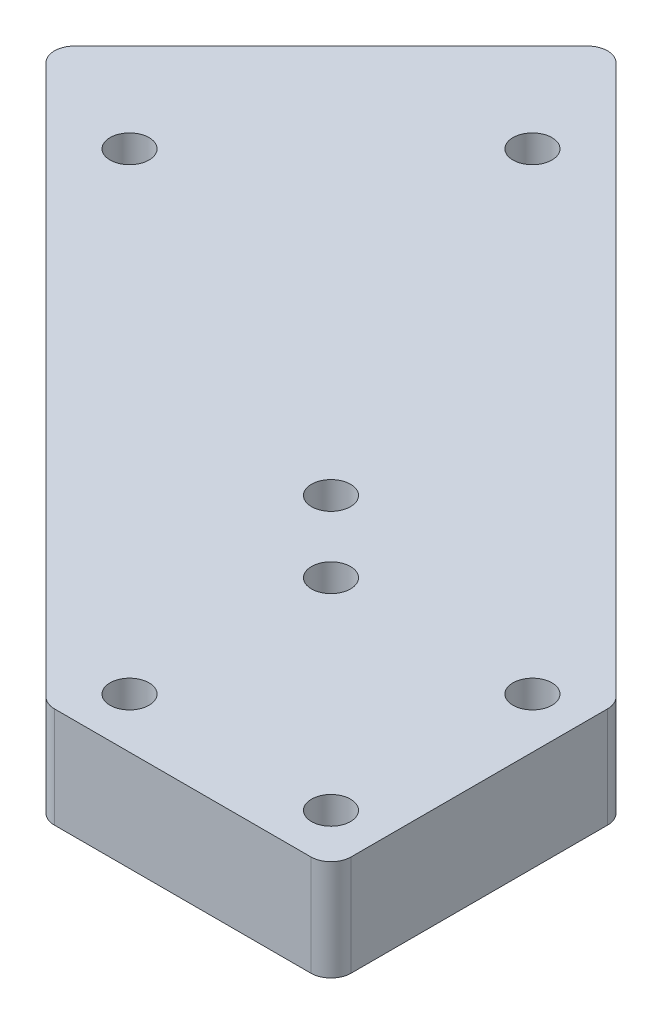
ISO-10303-21;
HEADER;
FILE_DESCRIPTION(('STEP AP214'),'2;1');
FILE_NAME('part.step','',(''),(''),'','','');
FILE_SCHEMA(('AUTOMOTIVE_DESIGN { 1 0 10303 214 1 1 1 1 }'));
ENDSEC;
DATA;
#1=APPLICATION_CONTEXT('core data for automotive mechanical design processes');
#2=APPLICATION_PROTOCOL_DEFINITION('international standard','automotive_design',2000,#1);
#3=PRODUCT_CONTEXT('',#1,'mechanical');
#4=PRODUCT('Part','Part','',(#3));
#5=PRODUCT_RELATED_PRODUCT_CATEGORY('part','',(#4));
#6=PRODUCT_DEFINITION_FORMATION('','',#4);
#7=PRODUCT_DEFINITION_CONTEXT('part definition',#1,'design');
#8=PRODUCT_DEFINITION('design','',#6,#7);
#9=PRODUCT_DEFINITION_SHAPE('','',#8);
#10=(LENGTH_UNIT() NAMED_UNIT(*) SI_UNIT(.MILLI.,.METRE.));
#11=(NAMED_UNIT(*) PLANE_ANGLE_UNIT() SI_UNIT($,.RADIAN.));
#12=(NAMED_UNIT(*) SI_UNIT($,.STERADIAN.) SOLID_ANGLE_UNIT());
#13=UNCERTAINTY_MEASURE_WITH_UNIT(LENGTH_MEASURE(1.E-05),#10,'distance_accuracy_value','');
#14=(GEOMETRIC_REPRESENTATION_CONTEXT(3) GLOBAL_UNCERTAINTY_ASSIGNED_CONTEXT((#13)) GLOBAL_UNIT_ASSIGNED_CONTEXT((#10,
#11,#12)) REPRESENTATION_CONTEXT('',''));
#15=CARTESIAN_POINT('',(0.,0.,0.));
#16=DIRECTION('',(0.,0.,1.));
#17=DIRECTION('',(1.,0.,0.));
#18=AXIS2_PLACEMENT_3D('',#15,#16,#17);
#19=CARTESIAN_POINT('',(0.,12.7,35.9210244842766));
#20=DIRECTION('',(0.,0.,-1.));
#21=DIRECTION('',(-1.,0.,0.));
#22=AXIS2_PLACEMENT_3D('',#19,#20,#21);
#23=PLANE('',#22);
#24=DIRECTION('',(1.,0.,0.));
#25=VECTOR('',#24,1.);
#26=CARTESIAN_POINT('',(0.,0.,35.9210244842766));
#27=LINE('',#26,#25);
#28=CARTESIAN_POINT('',(1.05210244842767,0.,35.9210244842766));
#29=VERTEX_POINT('',#28);
#30=CARTESIAN_POINT('',(33.3810244842766,0.,35.9210244842766));
#31=VERTEX_POINT('',#30);
#32=EDGE_CURVE('E212',#29,#31,#27,.T.);
#33=ORIENTED_EDGE('',*,*,#32,.T.);
#34=DIRECTION('',(0.,-1.,0.));
#35=VECTOR('',#34,1.);
#36=CARTESIAN_POINT('',(33.3810244842766,12.7,35.9210244842766));
#37=LINE('',#36,#35);
#38=CARTESIAN_POINT('',(33.3810244842766,12.7,35.9210244842766));
#39=VERTEX_POINT('',#38);
#40=EDGE_CURVE('E11',#31,#39,#37,.F.);
#41=ORIENTED_EDGE('',*,*,#40,.T.);
#42=DIRECTION('',(1.,0.,0.));
#43=VECTOR('',#42,1.);
#44=CARTESIAN_POINT('',(0.,12.7,35.9210244842766));
#45=LINE('',#44,#43);
#46=CARTESIAN_POINT('',(1.05210244842767,12.7,35.9210244842766));
#47=VERTEX_POINT('',#46);
#48=EDGE_CURVE('E159',#47,#39,#45,.T.);
#49=ORIENTED_EDGE('',*,*,#48,.F.);
#50=DIRECTION('',(0.,-1.,0.));
#51=VECTOR('',#50,1.);
#52=CARTESIAN_POINT('',(1.05210244842767,0.,35.9210244842766));
#53=LINE('',#52,#51);
#54=EDGE_CURVE('E54',#47,#29,#53,.T.);
#55=ORIENTED_EDGE('',*,*,#54,.T.);
#56=EDGE_LOOP('',(#33,#41,#49,#55));
#57=FACE_BOUND('',#56,.T.);
#58=ADVANCED_FACE('F45',(#57),#23,.F.);
#59=CARTESIAN_POINT('',(35.9210244842766,12.7,0.));
#60=DIRECTION('',(-1.,0.,0.));
#61=DIRECTION('',(0.,0.,1.));
#62=AXIS2_PLACEMENT_3D('',#59,#60,#61);
#63=PLANE('',#62);
#64=DIRECTION('',(0.,0.,-1.));
#65=VECTOR('',#64,1.);
#66=CARTESIAN_POINT('',(35.9210244842766,0.,0.));
#67=LINE('',#66,#65);
#68=CARTESIAN_POINT('',(35.9210244842766,0.,33.3810244842766));
#69=VERTEX_POINT('',#68);
#70=CARTESIAN_POINT('',(35.9210244842766,0.,1.05210244842766));
#71=VERTEX_POINT('',#70);
#72=EDGE_CURVE('E162',#69,#71,#67,.T.);
#73=ORIENTED_EDGE('',*,*,#72,.T.);
#74=DIRECTION('',(0.,-1.,0.));
#75=VECTOR('',#74,1.);
#76=CARTESIAN_POINT('',(35.9210244842766,12.7,1.05210244842766));
#77=LINE('',#76,#75);
#78=CARTESIAN_POINT('',(35.9210244842766,12.7,1.05210244842766));
#79=VERTEX_POINT('',#78);
#80=EDGE_CURVE('E61',#71,#79,#77,.F.);
#81=ORIENTED_EDGE('',*,*,#80,.T.);
#82=DIRECTION('',(0.,0.,-1.));
#83=VECTOR('',#82,1.);
#84=CARTESIAN_POINT('',(35.9210244842766,12.7,0.));
#85=LINE('',#84,#83);
#86=CARTESIAN_POINT('',(35.9210244842766,12.7,33.3810244842766));
#87=VERTEX_POINT('',#86);
#88=EDGE_CURVE('E153',#87,#79,#85,.T.);
#89=ORIENTED_EDGE('',*,*,#88,.F.);
#90=DIRECTION('',(0.,-1.,0.));
#91=VECTOR('',#90,1.);
#92=CARTESIAN_POINT('',(35.9210244842766,12.7,33.3810244842766));
#93=LINE('',#92,#91);
#94=EDGE_CURVE('E200',#87,#69,#93,.T.);
#95=ORIENTED_EDGE('',*,*,#94,.T.);
#96=EDGE_LOOP('',(#73,#81,#89,#95));
#97=FACE_BOUND('',#96,.T.);
#98=ADVANCED_FACE('F300',(#97),#63,.F.);
#99=CARTESIAN_POINT('',(0.,12.7,0.));
#100=DIRECTION('',(0.,1.,0.));
#101=DIRECTION('',(0.,0.,1.));
#102=AXIS2_PLACEMENT_3D('',#99,#100,#101);
#103=PLANE('',#102);
#104=CARTESIAN_POINT('',(-55.3542987302698,12.7,-29.9581344198867));
#105=DIRECTION('',(0.,1.,0.));
#106=DIRECTION('',(0.,0.,1.));
#107=AXIS2_PLACEMENT_3D('',#104,#105,#106);
#108=CIRCLE('',#107,2.45744999999999);
#109=CARTESIAN_POINT('',(-55.3542987302698,12.7,-27.5006844198867));
#110=VERTEX_POINT('',#109);
#111=EDGE_CURVE('E290',#110,#110,#108,.T.);
#112=ORIENTED_EDGE('',*,*,#111,.F.);
#113=EDGE_LOOP('',(#112));
#114=FACE_BOUND('',#113,.T.);
#115=CARTESIAN_POINT('',(-29.9581344198862,12.7,-55.3542987302702));
#116=DIRECTION('',(0.,1.,0.));
#117=DIRECTION('',(0.,0.,1.));
#118=AXIS2_PLACEMENT_3D('',#115,#116,#117);
#119=CIRCLE('',#118,2.45744999999999);
#120=CARTESIAN_POINT('',(-29.9581344198862,12.7,-52.8968487302703));
#121=VERTEX_POINT('',#120);
#122=EDGE_CURVE('E282',#121,#121,#119,.T.);
#123=ORIENTED_EDGE('',*,*,#122,.F.);
#124=EDGE_LOOP('',(#123));
#125=FACE_BOUND('',#124,.T.);
#126=CARTESIAN_POINT('',(29.5710244842766,12.7,29.5710244842766));
#127=DIRECTION('',(0.,-1.,0.));
#128=DIRECTION('',(0.,0.,-1.));
#129=AXIS2_PLACEMENT_3D('',#126,#127,#128);
#130=CIRCLE('',#129,2.45745);
#131=CARTESIAN_POINT('',(29.5710244842766,12.7,27.1135744842766));
#132=VERTEX_POINT('',#131);
#133=EDGE_CURVE('E270',#132,#132,#130,.T.);
#134=ORIENTED_EDGE('',*,*,#133,.T.);
#135=EDGE_LOOP('',(#134));
#136=FACE_BOUND('',#135,.T.);
#137=CARTESIAN_POINT('',(4.17102448427662,12.7,4.17102448427661));
#138=DIRECTION('',(0.,-1.,0.));
#139=DIRECTION('',(0.,0.,-1.));
#140=AXIS2_PLACEMENT_3D('',#137,#138,#139);
#141=CIRCLE('',#140,2.45745);
#142=CARTESIAN_POINT('',(4.17102448427662,12.7,1.71357448427662));
#143=VERTEX_POINT('',#142);
#144=EDGE_CURVE('E262',#143,#143,#141,.T.);
#145=ORIENTED_EDGE('',*,*,#144,.T.);
#146=EDGE_LOOP('',(#145));
#147=FACE_BOUND('',#146,.T.);
#148=CARTESIAN_POINT('',(29.5710244842766,12.7,4.17102448427661));
#149=DIRECTION('',(0.,-1.,0.));
#150=DIRECTION('',(0.,0.,-1.));
#151=AXIS2_PLACEMENT_3D('',#148,#149,#150);
#152=CIRCLE('',#151,2.45745);
#153=CARTESIAN_POINT('',(29.5710244842766,12.7,1.71357448427661));
#154=VERTEX_POINT('',#153);
#155=EDGE_CURVE('E254',#154,#154,#152,.T.);
#156=ORIENTED_EDGE('',*,*,#155,.T.);
#157=EDGE_LOOP('',(#156));
#158=FACE_BOUND('',#157,.T.);
#159=CARTESIAN_POINT('',(4.17102448427662,12.7,29.5710244842766));
#160=DIRECTION('',(0.,-1.,0.));
#161=DIRECTION('',(0.,0.,-1.));
#162=AXIS2_PLACEMENT_3D('',#159,#160,#161);
#163=CIRCLE('',#162,2.45745);
#164=CARTESIAN_POINT('',(4.17102448427662,12.7,27.1135744842766));
#165=VERTEX_POINT('',#164);
#166=EDGE_CURVE('E246',#165,#165,#163,.T.);
#167=ORIENTED_EDGE('',*,*,#166,.T.);
#168=EDGE_LOOP('',(#167));
#169=FACE_BOUND('',#168,.T.);
#170=CARTESIAN_POINT('',(-4.80923163679253,12.7,-4.80923163679254));
#171=DIRECTION('',(0.,-1.,0.));
#172=DIRECTION('',(0.,0.,-1.));
#173=AXIS2_PLACEMENT_3D('',#170,#171,#172);
#174=CIRCLE('',#173,2.45745);
#175=CARTESIAN_POINT('',(-4.80923163679253,12.7,-7.26668163679254));
#176=VERTEX_POINT('',#175);
#177=EDGE_CURVE('E233',#176,#176,#174,.T.);
#178=ORIENTED_EDGE('',*,*,#177,.T.);
#179=EDGE_LOOP('',(#178));
#180=FACE_BOUND('',#179,.T.);
#181=DIRECTION('',(-0.707106781186548,0.,-0.707106781186547));
#182=VECTOR('',#181,1.);
#183=CARTESIAN_POINT('',(-17.9605122421383,12.7,-53.8815367264149));
#184=LINE('',#183,#182);
#185=CARTESIAN_POINT('',(35.1770757084905,12.7,-0.743948775786173));
#186=VERTEX_POINT('',#185);
#187=CARTESIAN_POINT('',(-34.1249732600628,12.7,-70.0459977443394));
#188=VERTEX_POINT('',#187);
#189=EDGE_CURVE('E229',#186,#188,#184,.T.);
#190=ORIENTED_EDGE('',*,*,#189,.T.);
#191=CARTESIAN_POINT('',(-35.9210244842766,12.7,-68.2499465201256));
#192=DIRECTION('',(0.,1.,0.));
#193=DIRECTION('',(0.,0.,1.));
#194=AXIS2_PLACEMENT_3D('',#191,#192,#193);
#195=CIRCLE('',#194,2.54);
#196=CARTESIAN_POINT('',(-37.7170757084904,12.7,-70.0459977443394));
#197=VERTEX_POINT('',#196);
#198=EDGE_CURVE('E191',#188,#197,#195,.T.);
#199=ORIENTED_EDGE('',*,*,#198,.T.);
#200=DIRECTION('',(0.707106781186547,0.,-0.707106781186548));
#201=VECTOR('',#200,1.);
#202=CARTESIAN_POINT('',(-71.8420489685532,12.7,-35.9210244842766));
#203=LINE('',#202,#201);
#204=CARTESIAN_POINT('',(-70.0459977443394,12.7,-37.7170757084904));
#205=VERTEX_POINT('',#204);
#206=EDGE_CURVE('E147',#205,#197,#203,.T.);
#207=ORIENTED_EDGE('',*,*,#206,.F.);
#208=CARTESIAN_POINT('',(-68.2499465201256,12.7,-35.9210244842766));
#209=DIRECTION('',(0.,1.,0.));
#210=DIRECTION('',(0.,0.,1.));
#211=AXIS2_PLACEMENT_3D('',#208,#209,#210);
#212=CIRCLE('',#211,2.54);
#213=CARTESIAN_POINT('',(-70.0459977443394,12.7,-34.1249732600628));
#214=VERTEX_POINT('',#213);
#215=EDGE_CURVE('E151',#205,#214,#212,.T.);
#216=ORIENTED_EDGE('',*,*,#215,.T.);
#217=DIRECTION('',(-0.707106781186548,0.,-0.707106781186548));
#218=VECTOR('',#217,1.);
#219=CARTESIAN_POINT('',(0.,12.7,35.9210244842766));
#220=LINE('',#219,#218);
#221=CARTESIAN_POINT('',(-0.74394877578616,12.7,35.1770757084904));
#222=VERTEX_POINT('',#221);
#223=EDGE_CURVE('E228',#222,#214,#220,.T.);
#224=ORIENTED_EDGE('',*,*,#223,.F.);
#225=CARTESIAN_POINT('',(1.05210244842767,12.7,33.3810244842766));
#226=DIRECTION('',(0.,1.,0.));
#227=DIRECTION('',(0.,0.,1.));
#228=AXIS2_PLACEMENT_3D('',#225,#226,#227);
#229=CIRCLE('',#228,2.54);
#230=EDGE_CURVE('E181',#222,#47,#229,.T.);
#231=ORIENTED_EDGE('',*,*,#230,.T.);
#232=ORIENTED_EDGE('',*,*,#48,.T.);
#233=CARTESIAN_POINT('',(33.3810244842766,12.7,33.3810244842766));
#234=DIRECTION('',(0.,1.,0.));
#235=DIRECTION('',(0.,0.,1.));
#236=AXIS2_PLACEMENT_3D('',#233,#234,#235);
#237=CIRCLE('',#236,2.54);
#238=EDGE_CURVE('E68',#39,#87,#237,.T.);
#239=ORIENTED_EDGE('',*,*,#238,.T.);
#240=ORIENTED_EDGE('',*,*,#88,.T.);
#241=CARTESIAN_POINT('',(33.3810244842766,12.7,1.05210244842766));
#242=DIRECTION('',(0.,1.,0.));
#243=DIRECTION('',(0.,0.,1.));
#244=AXIS2_PLACEMENT_3D('',#241,#242,#243);
#245=CIRCLE('',#244,2.54);
#246=EDGE_CURVE('E186',#79,#186,#245,.T.);
#247=ORIENTED_EDGE('',*,*,#246,.T.);
#248=EDGE_LOOP('',(#190,#199,#207,#216,#224,#231,#232,#239,#240,#247));
#249=FACE_BOUND('',#248,.T.);
#250=ADVANCED_FACE('F297',(#114,#125,#136,#147,#158,#169,#180,#249),#103,.T.);
#251=CARTESIAN_POINT('',(0.,0.,0.));
#252=DIRECTION('',(0.,1.,0.));
#253=DIRECTION('',(0.,0.,1.));
#254=AXIS2_PLACEMENT_3D('',#251,#252,#253);
#255=PLANE('',#254);
#256=CARTESIAN_POINT('',(-55.3542987302698,0.,-29.9581344198867));
#257=DIRECTION('',(0.,1.,0.));
#258=DIRECTION('',(0.,0.,1.));
#259=AXIS2_PLACEMENT_3D('',#256,#257,#258);
#260=CIRCLE('',#259,2.45745);
#261=CARTESIAN_POINT('',(-55.3542987302698,0.,-27.5006844198867));
#262=VERTEX_POINT('',#261);
#263=EDGE_CURVE('E286',#262,#262,#260,.T.);
#264=ORIENTED_EDGE('',*,*,#263,.T.);
#265=EDGE_LOOP('',(#264));
#266=FACE_BOUND('',#265,.T.);
#267=CARTESIAN_POINT('',(-29.9581344198862,0.,-55.3542987302702));
#268=DIRECTION('',(0.,1.,0.));
#269=DIRECTION('',(0.,0.,1.));
#270=AXIS2_PLACEMENT_3D('',#267,#268,#269);
#271=CIRCLE('',#270,2.45745);
#272=CARTESIAN_POINT('',(-29.9581344198862,0.,-52.8968487302702));
#273=VERTEX_POINT('',#272);
#274=EDGE_CURVE('E278',#273,#273,#271,.T.);
#275=ORIENTED_EDGE('',*,*,#274,.T.);
#276=EDGE_LOOP('',(#275));
#277=FACE_BOUND('',#276,.T.);
#278=CARTESIAN_POINT('',(29.5710244842766,0.,29.5710244842766));
#279=DIRECTION('',(0.,-1.,0.));
#280=DIRECTION('',(0.,0.,-1.));
#281=AXIS2_PLACEMENT_3D('',#278,#279,#280);
#282=CIRCLE('',#281,2.45745);
#283=CARTESIAN_POINT('',(29.5710244842766,0.,27.1135744842766));
#284=VERTEX_POINT('',#283);
#285=EDGE_CURVE('E274',#284,#284,#282,.T.);
#286=ORIENTED_EDGE('',*,*,#285,.F.);
#287=EDGE_LOOP('',(#286));
#288=FACE_BOUND('',#287,.T.);
#289=CARTESIAN_POINT('',(4.17102448427662,0.,4.17102448427661));
#290=DIRECTION('',(0.,-1.,0.));
#291=DIRECTION('',(0.,0.,-1.));
#292=AXIS2_PLACEMENT_3D('',#289,#290,#291);
#293=CIRCLE('',#292,2.45745);
#294=CARTESIAN_POINT('',(4.17102448427662,0.,1.71357448427662));
#295=VERTEX_POINT('',#294);
#296=EDGE_CURVE('E266',#295,#295,#293,.T.);
#297=ORIENTED_EDGE('',*,*,#296,.F.);
#298=EDGE_LOOP('',(#297));
#299=FACE_BOUND('',#298,.T.);
#300=CARTESIAN_POINT('',(29.5710244842766,0.,4.17102448427661));
#301=DIRECTION('',(0.,-1.,0.));
#302=DIRECTION('',(0.,0.,-1.));
#303=AXIS2_PLACEMENT_3D('',#300,#301,#302);
#304=CIRCLE('',#303,2.45745);
#305=CARTESIAN_POINT('',(29.5710244842766,0.,1.71357448427661));
#306=VERTEX_POINT('',#305);
#307=EDGE_CURVE('E258',#306,#306,#304,.T.);
#308=ORIENTED_EDGE('',*,*,#307,.F.);
#309=EDGE_LOOP('',(#308));
#310=FACE_BOUND('',#309,.T.);
#311=CARTESIAN_POINT('',(4.17102448427662,0.,29.5710244842766));
#312=DIRECTION('',(0.,-1.,0.));
#313=DIRECTION('',(0.,0.,-1.));
#314=AXIS2_PLACEMENT_3D('',#311,#312,#313);
#315=CIRCLE('',#314,2.45745);
#316=CARTESIAN_POINT('',(4.17102448427662,0.,27.1135744842766));
#317=VERTEX_POINT('',#316);
#318=EDGE_CURVE('E250',#317,#317,#315,.T.);
#319=ORIENTED_EDGE('',*,*,#318,.F.);
#320=EDGE_LOOP('',(#319));
#321=FACE_BOUND('',#320,.T.);
#322=CARTESIAN_POINT('',(-4.80923163679253,0.,-4.80923163679254));
#323=DIRECTION('',(0.,-1.,0.));
#324=DIRECTION('',(0.,0.,-1.));
#325=AXIS2_PLACEMENT_3D('',#322,#323,#324);
#326=CIRCLE('',#325,2.45745);
#327=CARTESIAN_POINT('',(-4.80923163679253,0.,-7.26668163679254));
#328=VERTEX_POINT('',#327);
#329=EDGE_CURVE('E242',#328,#328,#326,.T.);
#330=ORIENTED_EDGE('',*,*,#329,.F.);
#331=EDGE_LOOP('',(#330));
#332=FACE_BOUND('',#331,.T.);
#333=DIRECTION('',(0.707106781186547,0.,-0.707106781186548));
#334=VECTOR('',#333,1.);
#335=CARTESIAN_POINT('',(-71.8420489685532,0.,-35.9210244842766));
#336=LINE('',#335,#334);
#337=CARTESIAN_POINT('',(-70.0459977443394,0.,-37.7170757084904));
#338=VERTEX_POINT('',#337);
#339=CARTESIAN_POINT('',(-37.7170757084904,0.,-70.0459977443394));
#340=VERTEX_POINT('',#339);
#341=EDGE_CURVE('E127',#338,#340,#336,.T.);
#342=ORIENTED_EDGE('',*,*,#341,.T.);
#343=CARTESIAN_POINT('',(-35.9210244842766,0.,-68.2499465201256));
#344=DIRECTION('',(0.,1.,0.));
#345=DIRECTION('',(0.,0.,1.));
#346=AXIS2_PLACEMENT_3D('',#343,#344,#345);
#347=CIRCLE('',#346,2.54);
#348=CARTESIAN_POINT('',(-34.1249732600628,0.,-70.0459977443394));
#349=VERTEX_POINT('',#348);
#350=EDGE_CURVE('E135',#340,#349,#347,.F.);
#351=ORIENTED_EDGE('',*,*,#350,.T.);
#352=DIRECTION('',(0.707106781186548,0.,0.707106781186547));
#353=VECTOR('',#352,1.);
#354=CARTESIAN_POINT('',(17.9605122421383,0.,-17.9605122421383));
#355=LINE('',#354,#353);
#356=CARTESIAN_POINT('',(35.1770757084904,0.,-0.743948775786173));
#357=VERTEX_POINT('',#356);
#358=EDGE_CURVE('E224',#349,#357,#355,.T.);
#359=ORIENTED_EDGE('',*,*,#358,.T.);
#360=CARTESIAN_POINT('',(33.3810244842766,0.,1.05210244842766));
#361=DIRECTION('',(0.,1.,0.));
#362=DIRECTION('',(0.,0.,1.));
#363=AXIS2_PLACEMENT_3D('',#360,#361,#362);
#364=CIRCLE('',#363,2.54);
#365=EDGE_CURVE('E136',#357,#71,#364,.F.);
#366=ORIENTED_EDGE('',*,*,#365,.T.);
#367=ORIENTED_EDGE('',*,*,#72,.F.);
#368=CARTESIAN_POINT('',(33.3810244842766,0.,33.3810244842766));
#369=DIRECTION('',(0.,1.,0.));
#370=DIRECTION('',(0.,0.,1.));
#371=AXIS2_PLACEMENT_3D('',#368,#369,#370);
#372=CIRCLE('',#371,2.54);
#373=EDGE_CURVE('E167',#69,#31,#372,.F.);
#374=ORIENTED_EDGE('',*,*,#373,.T.);
#375=ORIENTED_EDGE('',*,*,#32,.F.);
#376=CARTESIAN_POINT('',(1.05210244842767,0.,33.3810244842766));
#377=DIRECTION('',(0.,1.,0.));
#378=DIRECTION('',(0.,0.,1.));
#379=AXIS2_PLACEMENT_3D('',#376,#377,#378);
#380=CIRCLE('',#379,2.54);
#381=CARTESIAN_POINT('',(-0.743948775786162,0.,35.1770757084904));
#382=VERTEX_POINT('',#381);
#383=EDGE_CURVE('E157',#29,#382,#380,.F.);
#384=ORIENTED_EDGE('',*,*,#383,.T.);
#385=DIRECTION('',(0.707106781186548,0.,0.707106781186547));
#386=VECTOR('',#385,1.);
#387=CARTESIAN_POINT('',(-17.9605122421383,0.,17.9605122421383));
#388=LINE('',#387,#386);
#389=CARTESIAN_POINT('',(-70.0459977443394,0.,-34.1249732600628));
#390=VERTEX_POINT('',#389);
#391=EDGE_CURVE('E129',#390,#382,#388,.T.);
#392=ORIENTED_EDGE('',*,*,#391,.F.);
#393=CARTESIAN_POINT('',(-68.2499465201256,0.,-35.9210244842766));
#394=DIRECTION('',(0.,1.,0.));
#395=DIRECTION('',(0.,0.,1.));
#396=AXIS2_PLACEMENT_3D('',#393,#394,#395);
#397=CIRCLE('',#396,2.54);
#398=EDGE_CURVE('E124',#390,#338,#397,.F.);
#399=ORIENTED_EDGE('',*,*,#398,.T.);
#400=EDGE_LOOP('',(#342,#351,#359,#366,#367,#374,#375,#384,#392,#399));
#401=FACE_BOUND('',#400,.T.);
#402=ADVANCED_FACE('F126',(#266,#277,#288,#299,#310,#321,#332,#401),#255,.F.);
#403=CARTESIAN_POINT('',(-71.8420489685532,12.7,-35.9210244842766));
#404=DIRECTION('',(0.707106781186548,0.,0.707106781186547));
#405=DIRECTION('',(0.707106781186547,0.,-0.707106781186548));
#406=AXIS2_PLACEMENT_3D('',#403,#404,#405);
#407=PLANE('',#406);
#408=ORIENTED_EDGE('',*,*,#206,.T.);
#409=DIRECTION('',(0.,-1.,0.));
#410=VECTOR('',#409,1.);
#411=CARTESIAN_POINT('',(-37.7170757084904,12.7,-70.0459977443394));
#412=LINE('',#411,#410);
#413=EDGE_CURVE('E145',#197,#340,#412,.T.);
#414=ORIENTED_EDGE('',*,*,#413,.T.);
#415=ORIENTED_EDGE('',*,*,#341,.F.);
#416=DIRECTION('',(0.,-1.,0.));
#417=VECTOR('',#416,1.);
#418=CARTESIAN_POINT('',(-70.0459977443394,12.7,-37.7170757084904));
#419=LINE('',#418,#417);
#420=EDGE_CURVE('E142',#338,#205,#419,.F.);
#421=ORIENTED_EDGE('',*,*,#420,.T.);
#422=EDGE_LOOP('',(#408,#414,#415,#421));
#423=FACE_BOUND('',#422,.T.);
#424=ADVANCED_FACE('F141',(#423),#407,.F.);
#425=CARTESIAN_POINT('',(-17.9605122421383,0.,17.9605122421383));
#426=DIRECTION('',(-0.707106781186547,0.,0.707106781186548));
#427=DIRECTION('',(0.707106781186548,0.,0.707106781186547));
#428=AXIS2_PLACEMENT_3D('',#425,#426,#427);
#429=PLANE('',#428);
#430=ORIENTED_EDGE('',*,*,#223,.T.);
#431=DIRECTION('',(0.,-1.,0.));
#432=VECTOR('',#431,1.);
#433=CARTESIAN_POINT('',(-70.0459977443394,0.,-34.1249732600628));
#434=LINE('',#433,#432);
#435=EDGE_CURVE('E197',#214,#390,#434,.T.);
#436=ORIENTED_EDGE('',*,*,#435,.T.);
#437=ORIENTED_EDGE('',*,*,#391,.T.);
#438=DIRECTION('',(0.,-1.,0.));
#439=VECTOR('',#438,1.);
#440=CARTESIAN_POINT('',(-0.743948775786164,12.7,35.1770757084904));
#441=LINE('',#440,#439);
#442=EDGE_CURVE('E194',#382,#222,#441,.F.);
#443=ORIENTED_EDGE('',*,*,#442,.T.);
#444=EDGE_LOOP('',(#430,#436,#437,#443));
#445=FACE_BOUND('',#444,.T.);
#446=ADVANCED_FACE('F331',(#445),#429,.T.);
#447=CARTESIAN_POINT('',(17.9605122421383,0.,-17.9605122421383));
#448=DIRECTION('',(-0.707106781186547,0.,0.707106781186548));
#449=DIRECTION('',(0.707106781186548,0.,0.707106781186547));
#450=AXIS2_PLACEMENT_3D('',#447,#448,#449);
#451=PLANE('',#450);
#452=ORIENTED_EDGE('',*,*,#358,.F.);
#453=DIRECTION('',(0.,-1.,0.));
#454=VECTOR('',#453,1.);
#455=CARTESIAN_POINT('',(-34.1249732600628,0.,-70.0459977443394));
#456=LINE('',#455,#454);
#457=EDGE_CURVE('E178',#349,#188,#456,.F.);
#458=ORIENTED_EDGE('',*,*,#457,.T.);
#459=ORIENTED_EDGE('',*,*,#189,.F.);
#460=DIRECTION('',(0.,-1.,0.));
#461=VECTOR('',#460,1.);
#462=CARTESIAN_POINT('',(35.1770757084904,0.,-0.743948775786173));
#463=LINE('',#462,#461);
#464=EDGE_CURVE('E174',#186,#357,#463,.T.);
#465=ORIENTED_EDGE('',*,*,#464,.T.);
#466=EDGE_LOOP('',(#452,#458,#459,#465));
#467=FACE_BOUND('',#466,.T.);
#468=ADVANCED_FACE('F322',(#467),#451,.F.);
#469=CARTESIAN_POINT('',(-4.80923163679253,0.,-4.80923163679254));
#470=DIRECTION('',(0.,-1.,0.));
#471=DIRECTION('',(0.,0.,-1.));
#472=AXIS2_PLACEMENT_3D('',#469,#470,#471);
#473=CYLINDRICAL_SURFACE('',#472,2.45745);
#474=ORIENTED_EDGE('',*,*,#177,.F.);
#475=EDGE_LOOP('',(#474));
#476=FACE_BOUND('',#475,.T.);
#477=ORIENTED_EDGE('',*,*,#329,.T.);
#478=EDGE_LOOP('',(#477));
#479=FACE_BOUND('',#478,.T.);
#480=ADVANCED_FACE('F338',(#476,#479),#473,.F.);
#481=CARTESIAN_POINT('',(4.17102448427662,0.,29.5710244842766));
#482=DIRECTION('',(0.,-1.,0.));
#483=DIRECTION('',(0.,0.,-1.));
#484=AXIS2_PLACEMENT_3D('',#481,#482,#483);
#485=CYLINDRICAL_SURFACE('',#484,2.45745);
#486=ORIENTED_EDGE('',*,*,#166,.F.);
#487=EDGE_LOOP('',(#486));
#488=FACE_BOUND('',#487,.T.);
#489=ORIENTED_EDGE('',*,*,#318,.T.);
#490=EDGE_LOOP('',(#489));
#491=FACE_BOUND('',#490,.T.);
#492=ADVANCED_FACE('F414',(#488,#491),#485,.F.);
#493=CARTESIAN_POINT('',(29.5710244842766,0.,4.17102448427661));
#494=DIRECTION('',(0.,-1.,0.));
#495=DIRECTION('',(0.,0.,-1.));
#496=AXIS2_PLACEMENT_3D('',#493,#494,#495);
#497=CYLINDRICAL_SURFACE('',#496,2.45745);
#498=ORIENTED_EDGE('',*,*,#155,.F.);
#499=EDGE_LOOP('',(#498));
#500=FACE_BOUND('',#499,.T.);
#501=ORIENTED_EDGE('',*,*,#307,.T.);
#502=EDGE_LOOP('',(#501));
#503=FACE_BOUND('',#502,.T.);
#504=ADVANCED_FACE('F406',(#500,#503),#497,.F.);
#505=CARTESIAN_POINT('',(4.17102448427662,0.,4.17102448427661));
#506=DIRECTION('',(0.,-1.,0.));
#507=DIRECTION('',(0.,0.,-1.));
#508=AXIS2_PLACEMENT_3D('',#505,#506,#507);
#509=CYLINDRICAL_SURFACE('',#508,2.45745);
#510=ORIENTED_EDGE('',*,*,#144,.F.);
#511=EDGE_LOOP('',(#510));
#512=FACE_BOUND('',#511,.T.);
#513=ORIENTED_EDGE('',*,*,#296,.T.);
#514=EDGE_LOOP('',(#513));
#515=FACE_BOUND('',#514,.T.);
#516=ADVANCED_FACE('F398',(#512,#515),#509,.F.);
#517=CARTESIAN_POINT('',(29.5710244842766,0.,29.5710244842766));
#518=DIRECTION('',(0.,-1.,0.));
#519=DIRECTION('',(0.,0.,-1.));
#520=AXIS2_PLACEMENT_3D('',#517,#518,#519);
#521=CYLINDRICAL_SURFACE('',#520,2.45745);
#522=ORIENTED_EDGE('',*,*,#133,.F.);
#523=EDGE_LOOP('',(#522));
#524=FACE_BOUND('',#523,.T.);
#525=ORIENTED_EDGE('',*,*,#285,.T.);
#526=EDGE_LOOP('',(#525));
#527=FACE_BOUND('',#526,.T.);
#528=ADVANCED_FACE('F390',(#524,#527),#521,.F.);
#529=CARTESIAN_POINT('',(-29.9581344198862,12.7,-55.3542987302702));
#530=DIRECTION('',(0.,1.,0.));
#531=DIRECTION('',(0.,0.,1.));
#532=AXIS2_PLACEMENT_3D('',#529,#530,#531);
#533=CYLINDRICAL_SURFACE('',#532,2.45744999999999);
#534=ORIENTED_EDGE('',*,*,#274,.F.);
#535=EDGE_LOOP('',(#534));
#536=FACE_BOUND('',#535,.T.);
#537=ORIENTED_EDGE('',*,*,#122,.T.);
#538=EDGE_LOOP('',(#537));
#539=FACE_BOUND('',#538,.T.);
#540=ADVANCED_FACE('F382',(#536,#539),#533,.F.);
#541=CARTESIAN_POINT('',(-55.3542987302698,12.7,-29.9581344198867));
#542=DIRECTION('',(0.,1.,0.));
#543=DIRECTION('',(0.,0.,1.));
#544=AXIS2_PLACEMENT_3D('',#541,#542,#543);
#545=CYLINDRICAL_SURFACE('',#544,2.45744999999999);
#546=ORIENTED_EDGE('',*,*,#263,.F.);
#547=EDGE_LOOP('',(#546));
#548=FACE_BOUND('',#547,.T.);
#549=ORIENTED_EDGE('',*,*,#111,.T.);
#550=EDGE_LOOP('',(#549));
#551=FACE_BOUND('',#550,.T.);
#552=ADVANCED_FACE('F295',(#548,#551),#545,.F.);
#553=CARTESIAN_POINT('',(-35.9210244842766,12.7,-68.2499465201256));
#554=DIRECTION('',(0.,-1.,0.));
#555=DIRECTION('',(0.,0.,-1.));
#556=AXIS2_PLACEMENT_3D('',#553,#554,#555);
#557=CYLINDRICAL_SURFACE('',#556,2.54);
#558=ORIENTED_EDGE('',*,*,#198,.F.);
#559=ORIENTED_EDGE('',*,*,#457,.F.);
#560=ORIENTED_EDGE('',*,*,#350,.F.);
#561=ORIENTED_EDGE('',*,*,#413,.F.);
#562=EDGE_LOOP('',(#558,#559,#560,#561));
#563=FACE_BOUND('',#562,.T.);
#564=ADVANCED_FACE('F320',(#563),#557,.T.);
#565=CARTESIAN_POINT('',(-68.2499465201256,0.,-35.9210244842766));
#566=DIRECTION('',(0.,1.,0.));
#567=DIRECTION('',(0.,0.,1.));
#568=AXIS2_PLACEMENT_3D('',#565,#566,#567);
#569=CYLINDRICAL_SURFACE('',#568,2.54);
#570=ORIENTED_EDGE('',*,*,#215,.F.);
#571=ORIENTED_EDGE('',*,*,#420,.F.);
#572=ORIENTED_EDGE('',*,*,#398,.F.);
#573=ORIENTED_EDGE('',*,*,#435,.F.);
#574=EDGE_LOOP('',(#570,#571,#572,#573));
#575=FACE_BOUND('',#574,.T.);
#576=ADVANCED_FACE('F150',(#575),#569,.T.);
#577=CARTESIAN_POINT('',(33.3810244842766,0.,1.05210244842766));
#578=DIRECTION('',(0.,-1.,0.));
#579=DIRECTION('',(0.,0.,-1.));
#580=AXIS2_PLACEMENT_3D('',#577,#578,#579);
#581=CYLINDRICAL_SURFACE('',#580,2.54);
#582=ORIENTED_EDGE('',*,*,#246,.F.);
#583=ORIENTED_EDGE('',*,*,#80,.F.);
#584=ORIENTED_EDGE('',*,*,#365,.F.);
#585=ORIENTED_EDGE('',*,*,#464,.F.);
#586=EDGE_LOOP('',(#582,#583,#584,#585));
#587=FACE_BOUND('',#586,.T.);
#588=ADVANCED_FACE('F324',(#587),#581,.T.);
#589=CARTESIAN_POINT('',(33.3810244842766,12.7,33.3810244842766));
#590=DIRECTION('',(0.,-1.,0.));
#591=DIRECTION('',(0.,0.,-1.));
#592=AXIS2_PLACEMENT_3D('',#589,#590,#591);
#593=CYLINDRICAL_SURFACE('',#592,2.54);
#594=ORIENTED_EDGE('',*,*,#238,.F.);
#595=ORIENTED_EDGE('',*,*,#40,.F.);
#596=ORIENTED_EDGE('',*,*,#373,.F.);
#597=ORIENTED_EDGE('',*,*,#94,.F.);
#598=EDGE_LOOP('',(#594,#595,#596,#597));
#599=FACE_BOUND('',#598,.T.);
#600=ADVANCED_FACE('F327',(#599),#593,.T.);
#601=CARTESIAN_POINT('',(1.05210244842767,12.7,33.3810244842766));
#602=DIRECTION('',(0.,1.,0.));
#603=DIRECTION('',(0.,0.,1.));
#604=AXIS2_PLACEMENT_3D('',#601,#602,#603);
#605=CYLINDRICAL_SURFACE('',#604,2.54);
#606=ORIENTED_EDGE('',*,*,#230,.F.);
#607=ORIENTED_EDGE('',*,*,#442,.F.);
#608=ORIENTED_EDGE('',*,*,#383,.F.);
#609=ORIENTED_EDGE('',*,*,#54,.F.);
#610=EDGE_LOOP('',(#606,#607,#608,#609));
#611=FACE_BOUND('',#610,.T.);
#612=ADVANCED_FACE('F47',(#611),#605,.T.);
#613=CLOSED_SHELL('',(#58,#98,#250,#402,#424,#446,#468,#480,#492,#504,#516,#528,#540,#552,#564,
#576,#588,#600,#612));
#614=MANIFOLD_SOLID_BREP('B2',#613);
#615=ADVANCED_BREP_SHAPE_REPRESENTATION('',(#18,#614),#14);
#616=SHAPE_DEFINITION_REPRESENTATION(#9,#615);
ENDSEC;
END-ISO-10303-21;
